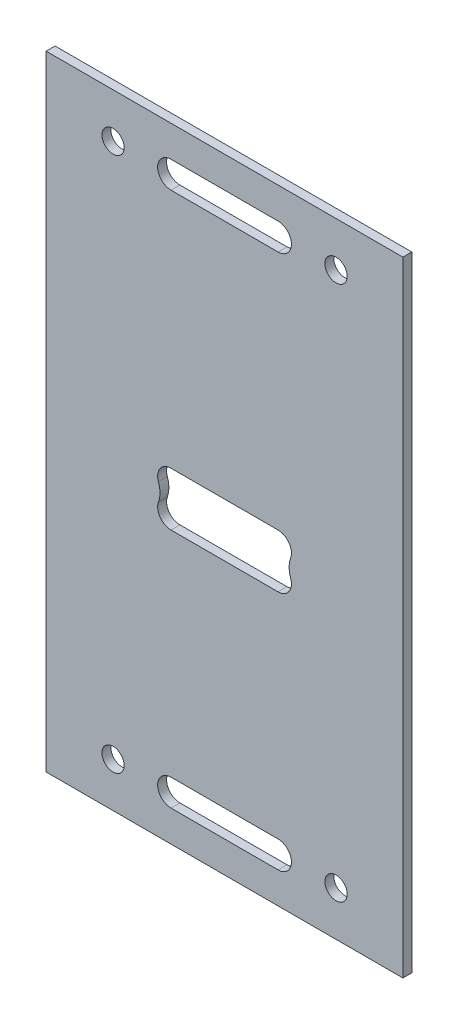
ISO-10303-21;
HEADER;
FILE_DESCRIPTION(('STEP AP214'),'2;1');
FILE_NAME('part.step','',(''),(''),'','','');
FILE_SCHEMA(('AUTOMOTIVE_DESIGN { 1 0 10303 214 1 1 1 1 }'));
ENDSEC;
DATA;
#1=APPLICATION_CONTEXT('core data for automotive mechanical design processes');
#2=APPLICATION_PROTOCOL_DEFINITION('international standard','automotive_design',2000,#1);
#3=PRODUCT_CONTEXT('',#1,'mechanical');
#4=PRODUCT('Part','Part','',(#3));
#5=PRODUCT_RELATED_PRODUCT_CATEGORY('part','',(#4));
#6=PRODUCT_DEFINITION_FORMATION('','',#4);
#7=PRODUCT_DEFINITION_CONTEXT('part definition',#1,'design');
#8=PRODUCT_DEFINITION('design','',#6,#7);
#9=PRODUCT_DEFINITION_SHAPE('','',#8);
#10=(LENGTH_UNIT() NAMED_UNIT(*) SI_UNIT(.MILLI.,.METRE.));
#11=(NAMED_UNIT(*) PLANE_ANGLE_UNIT() SI_UNIT($,.RADIAN.));
#12=(NAMED_UNIT(*) SI_UNIT($,.STERADIAN.) SOLID_ANGLE_UNIT());
#13=UNCERTAINTY_MEASURE_WITH_UNIT(LENGTH_MEASURE(1.E-05),#10,'distance_accuracy_value','');
#14=(GEOMETRIC_REPRESENTATION_CONTEXT(3) GLOBAL_UNCERTAINTY_ASSIGNED_CONTEXT((#13)) GLOBAL_UNIT_ASSIGNED_CONTEXT((#10,
#11,#12)) REPRESENTATION_CONTEXT('',''));
#15=CARTESIAN_POINT('',(0.,0.,0.));
#16=DIRECTION('',(0.,0.,1.));
#17=DIRECTION('',(1.,0.,0.));
#18=AXIS2_PLACEMENT_3D('',#15,#16,#17);
#19=CARTESIAN_POINT('',(0.,0.,1.));
#20=DIRECTION('',(0.,0.,-1.));
#21=DIRECTION('',(-1.,0.,0.));
#22=AXIS2_PLACEMENT_3D('',#19,#20,#21);
#23=PLANE('',#22);
#24=DIRECTION('',(1.,0.,0.));
#25=VECTOR('',#24,1.);
#26=CARTESIAN_POINT('',(-6.,28.5,1.));
#27=LINE('',#26,#25);
#28=CARTESIAN_POINT('',(-6.,28.5,1.));
#29=VERTEX_POINT('',#28);
#30=CARTESIAN_POINT('',(6.,28.5,1.));
#31=VERTEX_POINT('',#30);
#32=EDGE_CURVE('E217',#29,#31,#27,.T.);
#33=ORIENTED_EDGE('',*,*,#32,.F.);
#34=CARTESIAN_POINT('',(-6.,30.,1.));
#35=DIRECTION('',(0.,0.,1.));
#36=DIRECTION('',(1.,0.,0.));
#37=AXIS2_PLACEMENT_3D('',#34,#35,#36);
#38=CIRCLE('',#37,1.5);
#39=CARTESIAN_POINT('',(-6.,31.5,1.));
#40=VERTEX_POINT('',#39);
#41=EDGE_CURVE('E184',#40,#29,#38,.T.);
#42=ORIENTED_EDGE('',*,*,#41,.F.);
#43=DIRECTION('',(-1.,0.,0.));
#44=VECTOR('',#43,1.);
#45=CARTESIAN_POINT('',(-6.,31.5,1.));
#46=LINE('',#45,#44);
#47=CARTESIAN_POINT('',(6.,31.5,1.));
#48=VERTEX_POINT('',#47);
#49=EDGE_CURVE('E204',#48,#40,#46,.T.);
#50=ORIENTED_EDGE('',*,*,#49,.F.);
#51=CARTESIAN_POINT('',(6.,30.,1.));
#52=DIRECTION('',(0.,0.,1.));
#53=DIRECTION('',(1.,0.,0.));
#54=AXIS2_PLACEMENT_3D('',#51,#52,#53);
#55=CIRCLE('',#54,1.5);
#56=EDGE_CURVE('E208',#31,#48,#55,.T.);
#57=ORIENTED_EDGE('',*,*,#56,.F.);
#58=EDGE_LOOP('',(#33,#42,#50,#57));
#59=FACE_BOUND('',#58,.T.);
#60=CARTESIAN_POINT('',(6.,0.,1.));
#61=DIRECTION('',(0.,0.,1.));
#62=DIRECTION('',(1.,0.,0.));
#63=AXIS2_PLACEMENT_3D('',#60,#61,#62);
#64=CIRCLE('',#63,1.5);
#65=CARTESIAN_POINT('',(7.4142135623731,-0.499999999999999,1.));
#66=VERTEX_POINT('',#65);
#67=CARTESIAN_POINT('',(6.,1.5,1.));
#68=VERTEX_POINT('',#67);
#69=EDGE_CURVE('E271',#66,#68,#64,.T.);
#70=ORIENTED_EDGE('',*,*,#69,.F.);
#71=CARTESIAN_POINT('',(10.2426406871193,-1.5,1.));
#72=DIRECTION('',(0.,0.,-1.));
#73=DIRECTION('',(-1.,0.,0.));
#74=AXIS2_PLACEMENT_3D('',#71,#72,#73);
#75=CIRCLE('',#74,3.);
#76=CARTESIAN_POINT('',(7.4142135623731,-2.5,1.));
#77=VERTEX_POINT('',#76);
#78=EDGE_CURVE('E412',#66,#77,#75,.F.);
#79=ORIENTED_EDGE('',*,*,#78,.T.);
#80=CARTESIAN_POINT('',(6.,-3.,1.));
#81=DIRECTION('',(0.,0.,1.));
#82=DIRECTION('',(1.,0.,0.));
#83=AXIS2_PLACEMENT_3D('',#80,#81,#82);
#84=CIRCLE('',#83,1.5);
#85=CARTESIAN_POINT('',(6.,-4.5,1.));
#86=VERTEX_POINT('',#85);
#87=EDGE_CURVE('E267',#86,#77,#84,.T.);
#88=ORIENTED_EDGE('',*,*,#87,.F.);
#89=DIRECTION('',(1.,0.,0.));
#90=VECTOR('',#89,1.);
#91=CARTESIAN_POINT('',(-6.,-4.5,1.));
#92=LINE('',#91,#90);
#93=CARTESIAN_POINT('',(-6.,-4.5,1.));
#94=VERTEX_POINT('',#93);
#95=EDGE_CURVE('E263',#94,#86,#92,.T.);
#96=ORIENTED_EDGE('',*,*,#95,.F.);
#97=CARTESIAN_POINT('',(-6.,-3.,1.));
#98=DIRECTION('',(0.,0.,1.));
#99=DIRECTION('',(1.,0.,0.));
#100=AXIS2_PLACEMENT_3D('',#97,#98,#99);
#101=CIRCLE('',#100,1.5);
#102=CARTESIAN_POINT('',(-7.4142135623731,-2.5,1.));
#103=VERTEX_POINT('',#102);
#104=EDGE_CURVE('E259',#103,#94,#101,.T.);
#105=ORIENTED_EDGE('',*,*,#104,.F.);
#106=CARTESIAN_POINT('',(-10.2426406871193,-1.5,1.));
#107=DIRECTION('',(0.,0.,-1.));
#108=DIRECTION('',(-1.,0.,0.));
#109=AXIS2_PLACEMENT_3D('',#106,#107,#108);
#110=CIRCLE('',#109,3.);
#111=CARTESIAN_POINT('',(-7.4142135623731,-0.499999999999999,1.));
#112=VERTEX_POINT('',#111);
#113=EDGE_CURVE('E409',#103,#112,#110,.F.);
#114=ORIENTED_EDGE('',*,*,#113,.T.);
#115=CARTESIAN_POINT('',(-6.,0.,1.));
#116=DIRECTION('',(0.,0.,1.));
#117=DIRECTION('',(1.,0.,0.));
#118=AXIS2_PLACEMENT_3D('',#115,#116,#117);
#119=CIRCLE('',#118,1.5);
#120=CARTESIAN_POINT('',(-6.,1.5,1.));
#121=VERTEX_POINT('',#120);
#122=EDGE_CURVE('E256',#121,#112,#119,.T.);
#123=ORIENTED_EDGE('',*,*,#122,.F.);
#124=DIRECTION('',(-1.,0.,0.));
#125=VECTOR('',#124,1.);
#126=CARTESIAN_POINT('',(-6.,1.5,1.));
#127=LINE('',#126,#125);
#128=EDGE_CURVE('E237',#68,#121,#127,.T.);
#129=ORIENTED_EDGE('',*,*,#128,.F.);
#130=EDGE_LOOP('',(#70,#79,#88,#96,#105,#114,#123,#129));
#131=FACE_BOUND('',#130,.T.);
#132=DIRECTION('',(1.,0.,0.));
#133=VECTOR('',#132,1.);
#134=CARTESIAN_POINT('',(-6.,-31.5,1.));
#135=LINE('',#134,#133);
#136=CARTESIAN_POINT('',(-6.,-31.5,1.));
#137=VERTEX_POINT('',#136);
#138=CARTESIAN_POINT('',(6.,-31.5,1.));
#139=VERTEX_POINT('',#138);
#140=EDGE_CURVE('E310',#137,#139,#135,.T.);
#141=ORIENTED_EDGE('',*,*,#140,.F.);
#142=CARTESIAN_POINT('',(-6.,-30.,1.));
#143=DIRECTION('',(0.,0.,1.));
#144=DIRECTION('',(1.,0.,0.));
#145=AXIS2_PLACEMENT_3D('',#142,#143,#144);
#146=CIRCLE('',#145,1.5);
#147=CARTESIAN_POINT('',(-6.,-28.5,1.));
#148=VERTEX_POINT('',#147);
#149=EDGE_CURVE('E307',#148,#137,#146,.T.);
#150=ORIENTED_EDGE('',*,*,#149,.F.);
#151=DIRECTION('',(-1.,0.,0.));
#152=VECTOR('',#151,1.);
#153=CARTESIAN_POINT('',(-6.,-28.5,1.));
#154=LINE('',#153,#152);
#155=CARTESIAN_POINT('',(6.,-28.5,1.));
#156=VERTEX_POINT('',#155);
#157=EDGE_CURVE('E294',#156,#148,#154,.T.);
#158=ORIENTED_EDGE('',*,*,#157,.F.);
#159=CARTESIAN_POINT('',(6.,-30.,1.));
#160=DIRECTION('',(0.,0.,1.));
#161=DIRECTION('',(1.,0.,0.));
#162=AXIS2_PLACEMENT_3D('',#159,#160,#161);
#163=CIRCLE('',#162,1.5);
#164=EDGE_CURVE('E314',#139,#156,#163,.T.);
#165=ORIENTED_EDGE('',*,*,#164,.F.);
#166=EDGE_LOOP('',(#141,#150,#158,#165));
#167=FACE_BOUND('',#166,.T.);
#168=DIRECTION('',(0.,1.,0.));
#169=VECTOR('',#168,1.);
#170=CARTESIAN_POINT('',(20.,-35.,1.));
#171=LINE('',#170,#169);
#172=CARTESIAN_POINT('',(20.,-35.,1.));
#173=VERTEX_POINT('',#172);
#174=CARTESIAN_POINT('',(20.,35.,1.));
#175=VERTEX_POINT('',#174);
#176=EDGE_CURVE('E364',#173,#175,#171,.T.);
#177=ORIENTED_EDGE('',*,*,#176,.T.);
#178=DIRECTION('',(-1.,0.,0.));
#179=VECTOR('',#178,1.);
#180=CARTESIAN_POINT('',(-20.,35.,1.));
#181=LINE('',#180,#179);
#182=CARTESIAN_POINT('',(-20.,35.,1.));
#183=VERTEX_POINT('',#182);
#184=EDGE_CURVE('E368',#175,#183,#181,.T.);
#185=ORIENTED_EDGE('',*,*,#184,.T.);
#186=DIRECTION('',(0.,-1.,0.));
#187=VECTOR('',#186,1.);
#188=CARTESIAN_POINT('',(-20.,-35.,1.));
#189=LINE('',#188,#187);
#190=CARTESIAN_POINT('',(-20.,-35.,1.));
#191=VERTEX_POINT('',#190);
#192=EDGE_CURVE('E372',#183,#191,#189,.T.);
#193=ORIENTED_EDGE('',*,*,#192,.T.);
#194=DIRECTION('',(1.,0.,0.));
#195=VECTOR('',#194,1.);
#196=CARTESIAN_POINT('',(-20.,-35.,1.));
#197=LINE('',#196,#195);
#198=EDGE_CURVE('E375',#191,#173,#197,.T.);
#199=ORIENTED_EDGE('',*,*,#198,.T.);
#200=EDGE_LOOP('',(#177,#185,#193,#199));
#201=FACE_BOUND('',#200,.T.);
#202=CARTESIAN_POINT('',(-12.5,30.,1.));
#203=DIRECTION('',(0.,0.,1.));
#204=DIRECTION('',(1.,0.,0.));
#205=AXIS2_PLACEMENT_3D('',#202,#203,#204);
#206=CIRCLE('',#205,1.25);
#207=CARTESIAN_POINT('',(-11.25,30.,1.));
#208=VERTEX_POINT('',#207);
#209=EDGE_CURVE('E356',#208,#208,#206,.T.);
#210=ORIENTED_EDGE('',*,*,#209,.F.);
#211=EDGE_LOOP('',(#210));
#212=FACE_BOUND('',#211,.T.);
#213=CARTESIAN_POINT('',(12.5,30.,1.));
#214=DIRECTION('',(0.,0.,1.));
#215=DIRECTION('',(1.,0.,0.));
#216=AXIS2_PLACEMENT_3D('',#213,#214,#215);
#217=CIRCLE('',#216,1.25);
#218=CARTESIAN_POINT('',(13.75,30.,1.));
#219=VERTEX_POINT('',#218);
#220=EDGE_CURVE('E348',#219,#219,#217,.T.);
#221=ORIENTED_EDGE('',*,*,#220,.F.);
#222=EDGE_LOOP('',(#221));
#223=FACE_BOUND('',#222,.T.);
#224=CARTESIAN_POINT('',(-12.5,-30.,1.));
#225=DIRECTION('',(0.,0.,1.));
#226=DIRECTION('',(1.,0.,0.));
#227=AXIS2_PLACEMENT_3D('',#224,#225,#226);
#228=CIRCLE('',#227,1.25);
#229=CARTESIAN_POINT('',(-11.25,-30.,1.));
#230=VERTEX_POINT('',#229);
#231=EDGE_CURVE('E340',#230,#230,#228,.T.);
#232=ORIENTED_EDGE('',*,*,#231,.F.);
#233=EDGE_LOOP('',(#232));
#234=FACE_BOUND('',#233,.T.);
#235=CARTESIAN_POINT('',(12.5,-30.,1.));
#236=DIRECTION('',(0.,0.,1.));
#237=DIRECTION('',(1.,0.,0.));
#238=AXIS2_PLACEMENT_3D('',#235,#236,#237);
#239=CIRCLE('',#238,1.25);
#240=CARTESIAN_POINT('',(13.75,-30.,1.));
#241=VERTEX_POINT('',#240);
#242=EDGE_CURVE('E332',#241,#241,#239,.T.);
#243=ORIENTED_EDGE('',*,*,#242,.F.);
#244=EDGE_LOOP('',(#243));
#245=FACE_BOUND('',#244,.T.);
#246=ADVANCED_FACE('F39',(#59,#131,#167,#201,#212,#223,#234,#245),#23,.F.);
#247=CARTESIAN_POINT('',(0.,0.,0.));
#248=DIRECTION('',(0.,0.,-1.));
#249=DIRECTION('',(-1.,0.,0.));
#250=AXIS2_PLACEMENT_3D('',#247,#248,#249);
#251=PLANE('',#250);
#252=CARTESIAN_POINT('',(-6.,30.,0.));
#253=DIRECTION('',(0.,0.,1.));
#254=DIRECTION('',(1.,0.,0.));
#255=AXIS2_PLACEMENT_3D('',#252,#253,#254);
#256=CIRCLE('',#255,1.5);
#257=CARTESIAN_POINT('',(-6.,31.5,0.));
#258=VERTEX_POINT('',#257);
#259=CARTESIAN_POINT('',(-6.,28.5,0.));
#260=VERTEX_POINT('',#259);
#261=EDGE_CURVE('E181',#258,#260,#256,.T.);
#262=ORIENTED_EDGE('',*,*,#261,.T.);
#263=DIRECTION('',(1.,0.,0.));
#264=VECTOR('',#263,1.);
#265=CARTESIAN_POINT('',(-6.,28.5,0.));
#266=LINE('',#265,#264);
#267=CARTESIAN_POINT('',(6.,28.5,0.));
#268=VERTEX_POINT('',#267);
#269=EDGE_CURVE('E194',#260,#268,#266,.T.);
#270=ORIENTED_EDGE('',*,*,#269,.T.);
#271=CARTESIAN_POINT('',(6.,30.,0.));
#272=DIRECTION('',(0.,0.,1.));
#273=DIRECTION('',(1.,0.,0.));
#274=AXIS2_PLACEMENT_3D('',#271,#272,#273);
#275=CIRCLE('',#274,1.5);
#276=CARTESIAN_POINT('',(6.,31.5,0.));
#277=VERTEX_POINT('',#276);
#278=EDGE_CURVE('E199',#268,#277,#275,.T.);
#279=ORIENTED_EDGE('',*,*,#278,.T.);
#280=DIRECTION('',(-1.,0.,0.));
#281=VECTOR('',#280,1.);
#282=CARTESIAN_POINT('',(-6.,31.5,0.));
#283=LINE('',#282,#281);
#284=EDGE_CURVE('E190',#277,#258,#283,.T.);
#285=ORIENTED_EDGE('',*,*,#284,.T.);
#286=EDGE_LOOP('',(#262,#270,#279,#285));
#287=FACE_BOUND('',#286,.T.);
#288=CARTESIAN_POINT('',(6.,-3.,0.));
#289=DIRECTION('',(0.,0.,1.));
#290=DIRECTION('',(1.,0.,0.));
#291=AXIS2_PLACEMENT_3D('',#288,#289,#290);
#292=CIRCLE('',#291,1.5);
#293=CARTESIAN_POINT('',(6.,-4.5,0.));
#294=VERTEX_POINT('',#293);
#295=CARTESIAN_POINT('',(7.4142135623731,-2.5,0.));
#296=VERTEX_POINT('',#295);
#297=EDGE_CURVE('E244',#294,#296,#292,.T.);
#298=ORIENTED_EDGE('',*,*,#297,.T.);
#299=CARTESIAN_POINT('',(10.2426406871193,-1.5,0.));
#300=DIRECTION('',(0.,0.,-1.));
#301=DIRECTION('',(-1.,0.,0.));
#302=AXIS2_PLACEMENT_3D('',#299,#300,#301);
#303=CIRCLE('',#302,3.);
#304=CARTESIAN_POINT('',(7.4142135623731,-0.499999999999999,0.));
#305=VERTEX_POINT('',#304);
#306=EDGE_CURVE('E420',#296,#305,#303,.T.);
#307=ORIENTED_EDGE('',*,*,#306,.T.);
#308=CARTESIAN_POINT('',(6.,0.,0.));
#309=DIRECTION('',(0.,0.,1.));
#310=DIRECTION('',(1.,0.,0.));
#311=AXIS2_PLACEMENT_3D('',#308,#309,#310);
#312=CIRCLE('',#311,1.5);
#313=CARTESIAN_POINT('',(6.,1.5,0.));
#314=VERTEX_POINT('',#313);
#315=EDGE_CURVE('E248',#305,#314,#312,.T.);
#316=ORIENTED_EDGE('',*,*,#315,.T.);
#317=DIRECTION('',(-1.,0.,0.));
#318=VECTOR('',#317,1.);
#319=CARTESIAN_POINT('',(-6.,1.5,0.));
#320=LINE('',#319,#318);
#321=CARTESIAN_POINT('',(-6.,1.5,0.));
#322=VERTEX_POINT('',#321);
#323=EDGE_CURVE('E251',#314,#322,#320,.T.);
#324=ORIENTED_EDGE('',*,*,#323,.T.);
#325=CARTESIAN_POINT('',(-6.,0.,0.));
#326=DIRECTION('',(0.,0.,1.));
#327=DIRECTION('',(1.,0.,0.));
#328=AXIS2_PLACEMENT_3D('',#325,#326,#327);
#329=CIRCLE('',#328,1.5);
#330=CARTESIAN_POINT('',(-7.4142135623731,-0.499999999999999,0.));
#331=VERTEX_POINT('',#330);
#332=EDGE_CURVE('E233',#322,#331,#329,.T.);
#333=ORIENTED_EDGE('',*,*,#332,.T.);
#334=CARTESIAN_POINT('',(-10.2426406871193,-1.5,0.));
#335=DIRECTION('',(0.,0.,-1.));
#336=DIRECTION('',(-1.,0.,0.));
#337=AXIS2_PLACEMENT_3D('',#334,#335,#336);
#338=CIRCLE('',#337,3.);
#339=CARTESIAN_POINT('',(-7.4142135623731,-2.5,0.));
#340=VERTEX_POINT('',#339);
#341=EDGE_CURVE('E55',#331,#340,#338,.T.);
#342=ORIENTED_EDGE('',*,*,#341,.T.);
#343=CARTESIAN_POINT('',(-6.,-3.,0.));
#344=DIRECTION('',(0.,0.,1.));
#345=DIRECTION('',(1.,0.,0.));
#346=AXIS2_PLACEMENT_3D('',#343,#344,#345);
#347=CIRCLE('',#346,1.5);
#348=CARTESIAN_POINT('',(-6.,-4.5,0.));
#349=VERTEX_POINT('',#348);
#350=EDGE_CURVE('E236',#340,#349,#347,.T.);
#351=ORIENTED_EDGE('',*,*,#350,.T.);
#352=DIRECTION('',(1.,0.,0.));
#353=VECTOR('',#352,1.);
#354=CARTESIAN_POINT('',(-6.,-4.5,0.));
#355=LINE('',#354,#353);
#356=EDGE_CURVE('E240',#349,#294,#355,.T.);
#357=ORIENTED_EDGE('',*,*,#356,.T.);
#358=EDGE_LOOP('',(#298,#307,#316,#324,#333,#342,#351,#357));
#359=FACE_BOUND('',#358,.T.);
#360=CARTESIAN_POINT('',(-6.,-30.,0.));
#361=DIRECTION('',(0.,0.,1.));
#362=DIRECTION('',(1.,0.,0.));
#363=AXIS2_PLACEMENT_3D('',#360,#361,#362);
#364=CIRCLE('',#363,1.5);
#365=CARTESIAN_POINT('',(-6.,-28.5,0.));
#366=VERTEX_POINT('',#365);
#367=CARTESIAN_POINT('',(-6.,-31.5,0.));
#368=VERTEX_POINT('',#367);
#369=EDGE_CURVE('E289',#366,#368,#364,.T.);
#370=ORIENTED_EDGE('',*,*,#369,.T.);
#371=DIRECTION('',(1.,0.,0.));
#372=VECTOR('',#371,1.);
#373=CARTESIAN_POINT('',(-6.,-31.5,0.));
#374=LINE('',#373,#372);
#375=CARTESIAN_POINT('',(6.,-31.5,0.));
#376=VERTEX_POINT('',#375);
#377=EDGE_CURVE('E293',#368,#376,#374,.T.);
#378=ORIENTED_EDGE('',*,*,#377,.T.);
#379=CARTESIAN_POINT('',(6.,-30.,0.));
#380=DIRECTION('',(0.,0.,1.));
#381=DIRECTION('',(1.,0.,0.));
#382=AXIS2_PLACEMENT_3D('',#379,#380,#381);
#383=CIRCLE('',#382,1.5);
#384=CARTESIAN_POINT('',(6.,-28.5,0.));
#385=VERTEX_POINT('',#384);
#386=EDGE_CURVE('E298',#376,#385,#383,.T.);
#387=ORIENTED_EDGE('',*,*,#386,.T.);
#388=DIRECTION('',(-1.,0.,0.));
#389=VECTOR('',#388,1.);
#390=CARTESIAN_POINT('',(-6.,-28.5,0.));
#391=LINE('',#390,#389);
#392=EDGE_CURVE('E302',#385,#366,#391,.T.);
#393=ORIENTED_EDGE('',*,*,#392,.T.);
#394=EDGE_LOOP('',(#370,#378,#387,#393));
#395=FACE_BOUND('',#394,.T.);
#396=CARTESIAN_POINT('',(-12.5,-30.,0.));
#397=DIRECTION('',(0.,0.,1.));
#398=DIRECTION('',(1.,0.,0.));
#399=AXIS2_PLACEMENT_3D('',#396,#397,#398);
#400=CIRCLE('',#399,1.25);
#401=CARTESIAN_POINT('',(-11.25,-30.,0.));
#402=VERTEX_POINT('',#401);
#403=EDGE_CURVE('E336',#402,#402,#400,.T.);
#404=ORIENTED_EDGE('',*,*,#403,.T.);
#405=EDGE_LOOP('',(#404));
#406=FACE_BOUND('',#405,.T.);
#407=CARTESIAN_POINT('',(-12.5,30.,0.));
#408=DIRECTION('',(0.,0.,1.));
#409=DIRECTION('',(1.,0.,0.));
#410=AXIS2_PLACEMENT_3D('',#407,#408,#409);
#411=CIRCLE('',#410,1.25);
#412=CARTESIAN_POINT('',(-11.25,30.,0.));
#413=VERTEX_POINT('',#412);
#414=EDGE_CURVE('E352',#413,#413,#411,.T.);
#415=ORIENTED_EDGE('',*,*,#414,.T.);
#416=EDGE_LOOP('',(#415));
#417=FACE_BOUND('',#416,.T.);
#418=DIRECTION('',(0.,1.,0.));
#419=VECTOR('',#418,1.);
#420=CARTESIAN_POINT('',(20.,-35.,0.));
#421=LINE('',#420,#419);
#422=CARTESIAN_POINT('',(20.,-35.,0.));
#423=VERTEX_POINT('',#422);
#424=CARTESIAN_POINT('',(20.,35.,0.));
#425=VERTEX_POINT('',#424);
#426=EDGE_CURVE('E360',#423,#425,#421,.T.);
#427=ORIENTED_EDGE('',*,*,#426,.F.);
#428=DIRECTION('',(1.,0.,0.));
#429=VECTOR('',#428,1.);
#430=CARTESIAN_POINT('',(-20.,-35.,0.));
#431=LINE('',#430,#429);
#432=CARTESIAN_POINT('',(-20.,-35.,0.));
#433=VERTEX_POINT('',#432);
#434=EDGE_CURVE('E369',#433,#423,#431,.T.);
#435=ORIENTED_EDGE('',*,*,#434,.F.);
#436=DIRECTION('',(0.,-1.,0.));
#437=VECTOR('',#436,1.);
#438=CARTESIAN_POINT('',(-20.,-35.,0.));
#439=LINE('',#438,#437);
#440=CARTESIAN_POINT('',(-20.,35.,0.));
#441=VERTEX_POINT('',#440);
#442=EDGE_CURVE('E385',#441,#433,#439,.T.);
#443=ORIENTED_EDGE('',*,*,#442,.F.);
#444=DIRECTION('',(-1.,0.,0.));
#445=VECTOR('',#444,1.);
#446=CARTESIAN_POINT('',(-20.,35.,0.));
#447=LINE('',#446,#445);
#448=EDGE_CURVE('E382',#425,#441,#447,.T.);
#449=ORIENTED_EDGE('',*,*,#448,.F.);
#450=EDGE_LOOP('',(#427,#435,#443,#449));
#451=FACE_BOUND('',#450,.T.);
#452=CARTESIAN_POINT('',(12.5,30.,0.));
#453=DIRECTION('',(0.,0.,1.));
#454=DIRECTION('',(1.,0.,0.));
#455=AXIS2_PLACEMENT_3D('',#452,#453,#454);
#456=CIRCLE('',#455,1.25);
#457=CARTESIAN_POINT('',(13.75,30.,0.));
#458=VERTEX_POINT('',#457);
#459=EDGE_CURVE('E344',#458,#458,#456,.T.);
#460=ORIENTED_EDGE('',*,*,#459,.T.);
#461=EDGE_LOOP('',(#460));
#462=FACE_BOUND('',#461,.T.);
#463=CARTESIAN_POINT('',(12.5,-30.,0.));
#464=DIRECTION('',(0.,0.,1.));
#465=DIRECTION('',(1.,0.,0.));
#466=AXIS2_PLACEMENT_3D('',#463,#464,#465);
#467=CIRCLE('',#466,1.25);
#468=CARTESIAN_POINT('',(13.75,-30.,0.));
#469=VERTEX_POINT('',#468);
#470=EDGE_CURVE('E227',#469,#469,#467,.T.);
#471=ORIENTED_EDGE('',*,*,#470,.T.);
#472=EDGE_LOOP('',(#471));
#473=FACE_BOUND('',#472,.T.);
#474=ADVANCED_FACE('F201',(#287,#359,#395,#406,#417,#451,#462,#473),#251,.T.);
#475=CARTESIAN_POINT('',(20.,-35.,1.));
#476=DIRECTION('',(-1.,0.,0.));
#477=DIRECTION('',(0.,0.,1.));
#478=AXIS2_PLACEMENT_3D('',#475,#476,#477);
#479=PLANE('',#478);
#480=ORIENTED_EDGE('',*,*,#426,.T.);
#481=DIRECTION('',(0.,0.,-1.));
#482=VECTOR('',#481,1.);
#483=CARTESIAN_POINT('',(20.,35.,1.));
#484=LINE('',#483,#482);
#485=EDGE_CURVE('E401',#175,#425,#484,.T.);
#486=ORIENTED_EDGE('',*,*,#485,.F.);
#487=ORIENTED_EDGE('',*,*,#176,.F.);
#488=DIRECTION('',(0.,0.,-1.));
#489=VECTOR('',#488,1.);
#490=CARTESIAN_POINT('',(20.,-35.,1.));
#491=LINE('',#490,#489);
#492=EDGE_CURVE('E378',#173,#423,#491,.T.);
#493=ORIENTED_EDGE('',*,*,#492,.T.);
#494=EDGE_LOOP('',(#480,#486,#487,#493));
#495=FACE_BOUND('',#494,.T.);
#496=ADVANCED_FACE('F465',(#495),#479,.F.);
#497=CARTESIAN_POINT('',(-20.,35.,1.));
#498=DIRECTION('',(0.,-1.,0.));
#499=DIRECTION('',(0.,0.,-1.));
#500=AXIS2_PLACEMENT_3D('',#497,#498,#499);
#501=PLANE('',#500);
#502=ORIENTED_EDGE('',*,*,#448,.T.);
#503=DIRECTION('',(0.,0.,-1.));
#504=VECTOR('',#503,1.);
#505=CARTESIAN_POINT('',(-20.,35.,1.));
#506=LINE('',#505,#504);
#507=EDGE_CURVE('E397',#183,#441,#506,.T.);
#508=ORIENTED_EDGE('',*,*,#507,.F.);
#509=ORIENTED_EDGE('',*,*,#184,.F.);
#510=ORIENTED_EDGE('',*,*,#485,.T.);
#511=EDGE_LOOP('',(#502,#508,#509,#510));
#512=FACE_BOUND('',#511,.T.);
#513=ADVANCED_FACE('F478',(#512),#501,.F.);
#514=CARTESIAN_POINT('',(-20.,-35.,1.));
#515=DIRECTION('',(1.,0.,0.));
#516=DIRECTION('',(0.,0.,-1.));
#517=AXIS2_PLACEMENT_3D('',#514,#515,#516);
#518=PLANE('',#517);
#519=ORIENTED_EDGE('',*,*,#442,.T.);
#520=DIRECTION('',(0.,0.,-1.));
#521=VECTOR('',#520,1.);
#522=CARTESIAN_POINT('',(-20.,-35.,1.));
#523=LINE('',#522,#521);
#524=EDGE_CURVE('E393',#191,#433,#523,.T.);
#525=ORIENTED_EDGE('',*,*,#524,.F.);
#526=ORIENTED_EDGE('',*,*,#192,.F.);
#527=ORIENTED_EDGE('',*,*,#507,.T.);
#528=EDGE_LOOP('',(#519,#525,#526,#527));
#529=FACE_BOUND('',#528,.T.);
#530=ADVANCED_FACE('F474',(#529),#518,.F.);
#531=CARTESIAN_POINT('',(-20.,-35.,1.));
#532=DIRECTION('',(0.,1.,0.));
#533=DIRECTION('',(0.,0.,1.));
#534=AXIS2_PLACEMENT_3D('',#531,#532,#533);
#535=PLANE('',#534);
#536=ORIENTED_EDGE('',*,*,#434,.T.);
#537=ORIENTED_EDGE('',*,*,#492,.F.);
#538=ORIENTED_EDGE('',*,*,#198,.F.);
#539=ORIENTED_EDGE('',*,*,#524,.T.);
#540=EDGE_LOOP('',(#536,#537,#538,#539));
#541=FACE_BOUND('',#540,.T.);
#542=ADVANCED_FACE('F471',(#541),#535,.F.);
#543=CARTESIAN_POINT('',(-12.5,30.,1.));
#544=DIRECTION('',(0.,0.,-1.));
#545=DIRECTION('',(-1.,0.,0.));
#546=AXIS2_PLACEMENT_3D('',#543,#544,#545);
#547=CYLINDRICAL_SURFACE('',#546,1.25);
#548=ORIENTED_EDGE('',*,*,#209,.T.);
#549=EDGE_LOOP('',(#548));
#550=FACE_BOUND('',#549,.T.);
#551=ORIENTED_EDGE('',*,*,#414,.F.);
#552=EDGE_LOOP('',(#551));
#553=FACE_BOUND('',#552,.T.);
#554=ADVANCED_FACE('F468',(#550,#553),#547,.F.);
#555=CARTESIAN_POINT('',(12.5,30.,1.));
#556=DIRECTION('',(0.,0.,-1.));
#557=DIRECTION('',(-1.,0.,0.));
#558=AXIS2_PLACEMENT_3D('',#555,#556,#557);
#559=CYLINDRICAL_SURFACE('',#558,1.25);
#560=ORIENTED_EDGE('',*,*,#220,.T.);
#561=EDGE_LOOP('',(#560));
#562=FACE_BOUND('',#561,.T.);
#563=ORIENTED_EDGE('',*,*,#459,.F.);
#564=EDGE_LOOP('',(#563));
#565=FACE_BOUND('',#564,.T.);
#566=ADVANCED_FACE('F524',(#562,#565),#559,.F.);
#567=CARTESIAN_POINT('',(-12.5,-30.,1.));
#568=DIRECTION('',(0.,0.,-1.));
#569=DIRECTION('',(-1.,0.,0.));
#570=AXIS2_PLACEMENT_3D('',#567,#568,#569);
#571=CYLINDRICAL_SURFACE('',#570,1.25);
#572=ORIENTED_EDGE('',*,*,#231,.T.);
#573=EDGE_LOOP('',(#572));
#574=FACE_BOUND('',#573,.T.);
#575=ORIENTED_EDGE('',*,*,#403,.F.);
#576=EDGE_LOOP('',(#575));
#577=FACE_BOUND('',#576,.T.);
#578=ADVANCED_FACE('F513',(#574,#577),#571,.F.);
#579=CARTESIAN_POINT('',(12.5,-30.,1.));
#580=DIRECTION('',(0.,0.,-1.));
#581=DIRECTION('',(-1.,0.,0.));
#582=AXIS2_PLACEMENT_3D('',#579,#580,#581);
#583=CYLINDRICAL_SURFACE('',#582,1.25);
#584=ORIENTED_EDGE('',*,*,#242,.T.);
#585=EDGE_LOOP('',(#584));
#586=FACE_BOUND('',#585,.T.);
#587=ORIENTED_EDGE('',*,*,#470,.F.);
#588=EDGE_LOOP('',(#587));
#589=FACE_BOUND('',#588,.T.);
#590=ADVANCED_FACE('F509',(#586,#589),#583,.F.);
#591=CARTESIAN_POINT('',(-6.,-30.,0.));
#592=DIRECTION('',(0.,0.,1.));
#593=DIRECTION('',(1.,0.,0.));
#594=AXIS2_PLACEMENT_3D('',#591,#592,#593);
#595=CYLINDRICAL_SURFACE('',#594,1.5);
#596=ORIENTED_EDGE('',*,*,#149,.T.);
#597=DIRECTION('',(0.,0.,1.));
#598=VECTOR('',#597,1.);
#599=CARTESIAN_POINT('',(-6.,-31.5,0.));
#600=LINE('',#599,#598);
#601=EDGE_CURVE('E306',#368,#137,#600,.T.);
#602=ORIENTED_EDGE('',*,*,#601,.F.);
#603=ORIENTED_EDGE('',*,*,#369,.F.);
#604=DIRECTION('',(0.,0.,1.));
#605=VECTOR('',#604,1.);
#606=CARTESIAN_POINT('',(-6.,-28.5,0.));
#607=LINE('',#606,#605);
#608=EDGE_CURVE('E260',#366,#148,#607,.T.);
#609=ORIENTED_EDGE('',*,*,#608,.T.);
#610=EDGE_LOOP('',(#596,#602,#603,#609));
#611=FACE_BOUND('',#610,.T.);
#612=ADVANCED_FACE('F512',(#611),#595,.F.);
#613=CARTESIAN_POINT('',(-6.,-28.5,0.));
#614=DIRECTION('',(0.,1.,0.));
#615=DIRECTION('',(0.,0.,1.));
#616=AXIS2_PLACEMENT_3D('',#613,#614,#615);
#617=PLANE('',#616);
#618=ORIENTED_EDGE('',*,*,#157,.T.);
#619=ORIENTED_EDGE('',*,*,#608,.F.);
#620=ORIENTED_EDGE('',*,*,#392,.F.);
#621=DIRECTION('',(0.,0.,1.));
#622=VECTOR('',#621,1.);
#623=CARTESIAN_POINT('',(6.,-28.5,0.));
#624=LINE('',#623,#622);
#625=EDGE_CURVE('E323',#385,#156,#624,.T.);
#626=ORIENTED_EDGE('',*,*,#625,.T.);
#627=EDGE_LOOP('',(#618,#619,#620,#626));
#628=FACE_BOUND('',#627,.T.);
#629=ADVANCED_FACE('F521',(#628),#617,.F.);
#630=CARTESIAN_POINT('',(6.,-30.,0.));
#631=DIRECTION('',(0.,0.,1.));
#632=DIRECTION('',(1.,0.,0.));
#633=AXIS2_PLACEMENT_3D('',#630,#631,#632);
#634=CYLINDRICAL_SURFACE('',#633,1.5);
#635=ORIENTED_EDGE('',*,*,#164,.T.);
#636=ORIENTED_EDGE('',*,*,#625,.F.);
#637=ORIENTED_EDGE('',*,*,#386,.F.);
#638=DIRECTION('',(0.,0.,1.));
#639=VECTOR('',#638,1.);
#640=CARTESIAN_POINT('',(6.,-31.5,0.));
#641=LINE('',#640,#639);
#642=EDGE_CURVE('E326',#376,#139,#641,.T.);
#643=ORIENTED_EDGE('',*,*,#642,.T.);
#644=EDGE_LOOP('',(#635,#636,#637,#643));
#645=FACE_BOUND('',#644,.T.);
#646=ADVANCED_FACE('F640',(#645),#634,.F.);
#647=CARTESIAN_POINT('',(-6.,-31.5,0.));
#648=DIRECTION('',(0.,-1.,0.));
#649=DIRECTION('',(0.,0.,-1.));
#650=AXIS2_PLACEMENT_3D('',#647,#648,#649);
#651=PLANE('',#650);
#652=ORIENTED_EDGE('',*,*,#140,.T.);
#653=ORIENTED_EDGE('',*,*,#642,.F.);
#654=ORIENTED_EDGE('',*,*,#377,.F.);
#655=ORIENTED_EDGE('',*,*,#601,.T.);
#656=EDGE_LOOP('',(#652,#653,#654,#655));
#657=FACE_BOUND('',#656,.T.);
#658=ADVANCED_FACE('F635',(#657),#651,.F.);
#659=CARTESIAN_POINT('',(-6.,0.,0.));
#660=DIRECTION('',(0.,0.,1.));
#661=DIRECTION('',(1.,0.,0.));
#662=AXIS2_PLACEMENT_3D('',#659,#660,#661);
#663=CYLINDRICAL_SURFACE('',#662,1.5);
#664=ORIENTED_EDGE('',*,*,#122,.T.);
#665=DIRECTION('',(0.,0.,1.));
#666=VECTOR('',#665,1.);
#667=CARTESIAN_POINT('',(-7.4142135623731,-0.5,0.));
#668=LINE('',#667,#666);
#669=EDGE_CURVE('E11',#112,#331,#668,.F.);
#670=ORIENTED_EDGE('',*,*,#669,.T.);
#671=ORIENTED_EDGE('',*,*,#332,.F.);
#672=DIRECTION('',(0.,0.,1.));
#673=VECTOR('',#672,1.);
#674=CARTESIAN_POINT('',(-6.,1.5,0.));
#675=LINE('',#674,#673);
#676=EDGE_CURVE('E218',#322,#121,#675,.T.);
#677=ORIENTED_EDGE('',*,*,#676,.T.);
#678=EDGE_LOOP('',(#664,#670,#671,#677));
#679=FACE_BOUND('',#678,.T.);
#680=ADVANCED_FACE('F626',(#679),#663,.F.);
#681=CARTESIAN_POINT('',(-6.,1.5,0.));
#682=DIRECTION('',(0.,1.,0.));
#683=DIRECTION('',(0.,0.,1.));
#684=AXIS2_PLACEMENT_3D('',#681,#682,#683);
#685=PLANE('',#684);
#686=ORIENTED_EDGE('',*,*,#128,.T.);
#687=ORIENTED_EDGE('',*,*,#676,.F.);
#688=ORIENTED_EDGE('',*,*,#323,.F.);
#689=DIRECTION('',(0.,0.,1.));
#690=VECTOR('',#689,1.);
#691=CARTESIAN_POINT('',(6.,1.5,0.));
#692=LINE('',#691,#690);
#693=EDGE_CURVE('E279',#314,#68,#692,.T.);
#694=ORIENTED_EDGE('',*,*,#693,.T.);
#695=EDGE_LOOP('',(#686,#687,#688,#694));
#696=FACE_BOUND('',#695,.T.);
#697=ADVANCED_FACE('F453',(#696),#685,.F.);
#698=CARTESIAN_POINT('',(6.,0.,0.));
#699=DIRECTION('',(0.,0.,1.));
#700=DIRECTION('',(1.,0.,0.));
#701=AXIS2_PLACEMENT_3D('',#698,#699,#700);
#702=CYLINDRICAL_SURFACE('',#701,1.5);
#703=ORIENTED_EDGE('',*,*,#315,.F.);
#704=DIRECTION('',(0.,0.,1.));
#705=VECTOR('',#704,1.);
#706=CARTESIAN_POINT('',(7.4142135623731,-0.499999999999999,0.));
#707=LINE('',#706,#705);
#708=EDGE_CURVE('E405',#305,#66,#707,.T.);
#709=ORIENTED_EDGE('',*,*,#708,.T.);
#710=ORIENTED_EDGE('',*,*,#69,.T.);
#711=ORIENTED_EDGE('',*,*,#693,.F.);
#712=EDGE_LOOP('',(#703,#709,#710,#711));
#713=FACE_BOUND('',#712,.T.);
#714=ADVANCED_FACE('F449',(#713),#702,.F.);
#715=CARTESIAN_POINT('',(6.,-3.,0.));
#716=DIRECTION('',(0.,0.,1.));
#717=DIRECTION('',(1.,0.,0.));
#718=AXIS2_PLACEMENT_3D('',#715,#716,#717);
#719=CYLINDRICAL_SURFACE('',#718,1.5);
#720=ORIENTED_EDGE('',*,*,#87,.T.);
#721=DIRECTION('',(0.,0.,1.));
#722=VECTOR('',#721,1.);
#723=CARTESIAN_POINT('',(7.4142135623731,-2.5,0.));
#724=LINE('',#723,#722);
#725=EDGE_CURVE('E415',#77,#296,#724,.F.);
#726=ORIENTED_EDGE('',*,*,#725,.T.);
#727=ORIENTED_EDGE('',*,*,#297,.F.);
#728=DIRECTION('',(0.,0.,1.));
#729=VECTOR('',#728,1.);
#730=CARTESIAN_POINT('',(6.,-4.5,0.));
#731=LINE('',#730,#729);
#732=EDGE_CURVE('E283',#294,#86,#731,.T.);
#733=ORIENTED_EDGE('',*,*,#732,.T.);
#734=EDGE_LOOP('',(#720,#726,#727,#733));
#735=FACE_BOUND('',#734,.T.);
#736=ADVANCED_FACE('F615',(#735),#719,.F.);
#737=CARTESIAN_POINT('',(-6.,-4.5,0.));
#738=DIRECTION('',(0.,-1.,0.));
#739=DIRECTION('',(0.,0.,-1.));
#740=AXIS2_PLACEMENT_3D('',#737,#738,#739);
#741=PLANE('',#740);
#742=ORIENTED_EDGE('',*,*,#95,.T.);
#743=ORIENTED_EDGE('',*,*,#732,.F.);
#744=ORIENTED_EDGE('',*,*,#356,.F.);
#745=DIRECTION('',(0.,0.,1.));
#746=VECTOR('',#745,1.);
#747=CARTESIAN_POINT('',(-6.,-4.5,0.));
#748=LINE('',#747,#746);
#749=EDGE_CURVE('E255',#349,#94,#748,.T.);
#750=ORIENTED_EDGE('',*,*,#749,.T.);
#751=EDGE_LOOP('',(#742,#743,#744,#750));
#752=FACE_BOUND('',#751,.T.);
#753=ADVANCED_FACE('F437',(#752),#741,.F.);
#754=CARTESIAN_POINT('',(-6.,-3.,0.));
#755=DIRECTION('',(0.,0.,1.));
#756=DIRECTION('',(1.,0.,0.));
#757=AXIS2_PLACEMENT_3D('',#754,#755,#756);
#758=CYLINDRICAL_SURFACE('',#757,1.5);
#759=ORIENTED_EDGE('',*,*,#350,.F.);
#760=DIRECTION('',(0.,0.,1.));
#761=VECTOR('',#760,1.);
#762=CARTESIAN_POINT('',(-7.4142135623731,-2.5,0.));
#763=LINE('',#762,#761);
#764=EDGE_CURVE('E48',#340,#103,#763,.T.);
#765=ORIENTED_EDGE('',*,*,#764,.T.);
#766=ORIENTED_EDGE('',*,*,#104,.T.);
#767=ORIENTED_EDGE('',*,*,#749,.F.);
#768=EDGE_LOOP('',(#759,#765,#766,#767));
#769=FACE_BOUND('',#768,.T.);
#770=ADVANCED_FACE('F427',(#769),#758,.F.);
#771=CARTESIAN_POINT('',(-6.,30.,0.));
#772=DIRECTION('',(0.,0.,1.));
#773=DIRECTION('',(1.,0.,0.));
#774=AXIS2_PLACEMENT_3D('',#771,#772,#773);
#775=CYLINDRICAL_SURFACE('',#774,1.5);
#776=ORIENTED_EDGE('',*,*,#41,.T.);
#777=DIRECTION('',(0.,0.,1.));
#778=VECTOR('',#777,1.);
#779=CARTESIAN_POINT('',(-6.,28.5,0.));
#780=LINE('',#779,#778);
#781=EDGE_CURVE('E177',#260,#29,#780,.T.);
#782=ORIENTED_EDGE('',*,*,#781,.F.);
#783=ORIENTED_EDGE('',*,*,#261,.F.);
#784=DIRECTION('',(0.,0.,1.));
#785=VECTOR('',#784,1.);
#786=CARTESIAN_POINT('',(-6.,31.5,0.));
#787=LINE('',#786,#785);
#788=EDGE_CURVE('E224',#258,#40,#787,.T.);
#789=ORIENTED_EDGE('',*,*,#788,.T.);
#790=EDGE_LOOP('',(#776,#782,#783,#789));
#791=FACE_BOUND('',#790,.T.);
#792=ADVANCED_FACE('F179',(#791),#775,.F.);
#793=CARTESIAN_POINT('',(-6.,31.5,0.));
#794=DIRECTION('',(0.,1.,0.));
#795=DIRECTION('',(0.,0.,1.));
#796=AXIS2_PLACEMENT_3D('',#793,#794,#795);
#797=PLANE('',#796);
#798=ORIENTED_EDGE('',*,*,#49,.T.);
#799=ORIENTED_EDGE('',*,*,#788,.F.);
#800=ORIENTED_EDGE('',*,*,#284,.F.);
#801=DIRECTION('',(0.,0.,1.));
#802=VECTOR('',#801,1.);
#803=CARTESIAN_POINT('',(6.,31.5,0.));
#804=LINE('',#803,#802);
#805=EDGE_CURVE('E228',#277,#48,#804,.T.);
#806=ORIENTED_EDGE('',*,*,#805,.T.);
#807=EDGE_LOOP('',(#798,#799,#800,#806));
#808=FACE_BOUND('',#807,.T.);
#809=ADVANCED_FACE('F586',(#808),#797,.F.);
#810=CARTESIAN_POINT('',(6.,30.,0.));
#811=DIRECTION('',(0.,0.,1.));
#812=DIRECTION('',(1.,0.,0.));
#813=AXIS2_PLACEMENT_3D('',#810,#811,#812);
#814=CYLINDRICAL_SURFACE('',#813,1.5);
#815=ORIENTED_EDGE('',*,*,#56,.T.);
#816=ORIENTED_EDGE('',*,*,#805,.F.);
#817=ORIENTED_EDGE('',*,*,#278,.F.);
#818=DIRECTION('',(0.,0.,1.));
#819=VECTOR('',#818,1.);
#820=CARTESIAN_POINT('',(6.,28.5,0.));
#821=LINE('',#820,#819);
#822=EDGE_CURVE('E189',#268,#31,#821,.T.);
#823=ORIENTED_EDGE('',*,*,#822,.T.);
#824=EDGE_LOOP('',(#815,#816,#817,#823));
#825=FACE_BOUND('',#824,.T.);
#826=ADVANCED_FACE('F576',(#825),#814,.F.);
#827=CARTESIAN_POINT('',(-6.,28.5,0.));
#828=DIRECTION('',(0.,-1.,0.));
#829=DIRECTION('',(0.,0.,-1.));
#830=AXIS2_PLACEMENT_3D('',#827,#828,#829);
#831=PLANE('',#830);
#832=ORIENTED_EDGE('',*,*,#32,.T.);
#833=ORIENTED_EDGE('',*,*,#822,.F.);
#834=ORIENTED_EDGE('',*,*,#269,.F.);
#835=ORIENTED_EDGE('',*,*,#781,.T.);
#836=EDGE_LOOP('',(#832,#833,#834,#835));
#837=FACE_BOUND('',#836,.T.);
#838=ADVANCED_FACE('F195',(#837),#831,.F.);
#839=CARTESIAN_POINT('',(10.2426406871193,-1.5,0.));
#840=DIRECTION('',(0.,0.,1.));
#841=DIRECTION('',(1.,0.,0.));
#842=AXIS2_PLACEMENT_3D('',#839,#840,#841);
#843=CYLINDRICAL_SURFACE('',#842,3.);
#844=ORIENTED_EDGE('',*,*,#306,.F.);
#845=ORIENTED_EDGE('',*,*,#725,.F.);
#846=ORIENTED_EDGE('',*,*,#78,.F.);
#847=ORIENTED_EDGE('',*,*,#708,.F.);
#848=EDGE_LOOP('',(#844,#845,#846,#847));
#849=FACE_BOUND('',#848,.T.);
#850=ADVANCED_FACE('F447',(#849),#843,.T.);
#851=CARTESIAN_POINT('',(-10.2426406871193,-1.5,0.));
#852=DIRECTION('',(0.,0.,1.));
#853=DIRECTION('',(1.,0.,0.));
#854=AXIS2_PLACEMENT_3D('',#851,#852,#853);
#855=CYLINDRICAL_SURFACE('',#854,3.);
#856=ORIENTED_EDGE('',*,*,#341,.F.);
#857=ORIENTED_EDGE('',*,*,#669,.F.);
#858=ORIENTED_EDGE('',*,*,#113,.F.);
#859=ORIENTED_EDGE('',*,*,#764,.F.);
#860=EDGE_LOOP('',(#856,#857,#858,#859));
#861=FACE_BOUND('',#860,.T.);
#862=ADVANCED_FACE('F41',(#861),#855,.T.);
#863=CLOSED_SHELL('',(#246,#474,#496,#513,#530,#542,#554,#566,#578,#590,#612,#629,#646,#658,
#680,#697,#714,#736,#753,#770,#792,#809,#826,#838,#850,#862));
#864=MANIFOLD_SOLID_BREP('B2',#863);
#865=ADVANCED_BREP_SHAPE_REPRESENTATION('',(#18,#864),#14);
#866=SHAPE_DEFINITION_REPRESENTATION(#9,#865);
ENDSEC;
END-ISO-10303-21;
